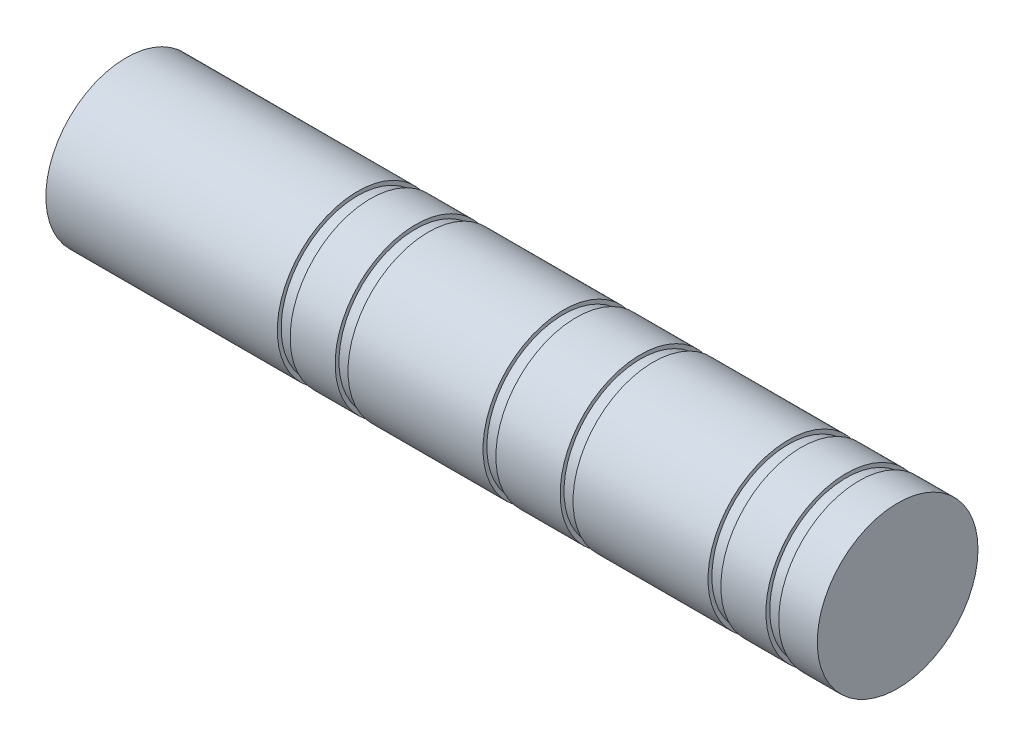
ISO-10303-21;
HEADER;
FILE_DESCRIPTION(('STEP AP214'),'2;1');
FILE_NAME('part.step','',(''),(''),'','','');
FILE_SCHEMA(('AUTOMOTIVE_DESIGN { 1 0 10303 214 1 1 1 1 }'));
ENDSEC;
DATA;
#1=APPLICATION_CONTEXT('core data for automotive mechanical design processes');
#2=APPLICATION_PROTOCOL_DEFINITION('international standard','automotive_design',2000,#1);
#3=PRODUCT_CONTEXT('',#1,'mechanical');
#4=PRODUCT('Part','Part','',(#3));
#5=PRODUCT_RELATED_PRODUCT_CATEGORY('part','',(#4));
#6=PRODUCT_DEFINITION_FORMATION('','',#4);
#7=PRODUCT_DEFINITION_CONTEXT('part definition',#1,'design');
#8=PRODUCT_DEFINITION('design','',#6,#7);
#9=PRODUCT_DEFINITION_SHAPE('','',#8);
#10=(LENGTH_UNIT() NAMED_UNIT(*) SI_UNIT(.MILLI.,.METRE.));
#11=(NAMED_UNIT(*) PLANE_ANGLE_UNIT() SI_UNIT($,.RADIAN.));
#12=(NAMED_UNIT(*) SI_UNIT($,.STERADIAN.) SOLID_ANGLE_UNIT());
#13=UNCERTAINTY_MEASURE_WITH_UNIT(LENGTH_MEASURE(1.E-05),#10,'distance_accuracy_value','');
#14=(GEOMETRIC_REPRESENTATION_CONTEXT(3) GLOBAL_UNCERTAINTY_ASSIGNED_CONTEXT((#13)) GLOBAL_UNIT_ASSIGNED_CONTEXT((#10,
#11,#12)) REPRESENTATION_CONTEXT('',''));
#15=CARTESIAN_POINT('',(0.,0.,0.));
#16=DIRECTION('',(0.,0.,1.));
#17=DIRECTION('',(1.,0.,0.));
#18=AXIS2_PLACEMENT_3D('',#15,#16,#17);
#19=CARTESIAN_POINT('',(12.,0.,0.));
#20=DIRECTION('',(-1.,0.,0.));
#21=DIRECTION('',(0.,0.,1.));
#22=AXIS2_PLACEMENT_3D('',#19,#20,#21);
#23=CYLINDRICAL_SURFACE('',#22,2.5);
#24=CARTESIAN_POINT('',(-4.8,0.,0.));
#25=DIRECTION('',(1.,0.,0.));
#26=DIRECTION('',(0.,0.,-1.));
#27=AXIS2_PLACEMENT_3D('',#24,#25,#26);
#28=CIRCLE('',#27,2.5);
#29=CARTESIAN_POINT('',(-4.8,0.,-2.5));
#30=VERTEX_POINT('',#29);
#31=EDGE_CURVE('E134',#30,#30,#28,.T.);
#32=ORIENTED_EDGE('',*,*,#31,.F.);
#33=EDGE_LOOP('',(#32));
#34=FACE_BOUND('',#33,.T.);
#35=CARTESIAN_POINT('',(-12.,0.,0.));
#36=DIRECTION('',(1.,0.,0.));
#37=DIRECTION('',(0.,0.,-1.));
#38=AXIS2_PLACEMENT_3D('',#35,#36,#37);
#39=CIRCLE('',#38,2.5);
#40=CARTESIAN_POINT('',(-12.,0.,-2.5));
#41=VERTEX_POINT('',#40);
#42=EDGE_CURVE('E48',#41,#41,#39,.T.);
#43=ORIENTED_EDGE('',*,*,#42,.T.);
#44=EDGE_LOOP('',(#43));
#45=FACE_BOUND('',#44,.T.);
#46=ADVANCED_FACE('F45',(#34,#45),#23,.T.);
#47=CARTESIAN_POINT('',(-12.,0.,0.));
#48=DIRECTION('',(1.,0.,0.));
#49=DIRECTION('',(0.,0.,-1.));
#50=AXIS2_PLACEMENT_3D('',#47,#48,#49);
#51=PLANE('',#50);
#52=CARTESIAN_POINT('',(-12.,0.,0.));
#53=DIRECTION('',(-1.,0.,0.));
#54=DIRECTION('',(0.,0.,1.));
#55=AXIS2_PLACEMENT_3D('',#52,#53,#54);
#56=CIRCLE('',#55,1.397);
#57=CARTESIAN_POINT('',(-12.,0.,1.397));
#58=VERTEX_POINT('',#57);
#59=EDGE_CURVE('E66',#58,#58,#56,.T.);
#60=ORIENTED_EDGE('',*,*,#59,.F.);
#61=EDGE_LOOP('',(#60));
#62=FACE_BOUND('',#61,.T.);
#63=ORIENTED_EDGE('',*,*,#42,.F.);
#64=EDGE_LOOP('',(#63));
#65=FACE_BOUND('',#64,.T.);
#66=ADVANCED_FACE('F59',(#62,#65),#51,.F.);
#67=CARTESIAN_POINT('',(-7.,0.,0.));
#68=DIRECTION('',(-1.,0.,0.));
#69=DIRECTION('',(0.,0.,1.));
#70=AXIS2_PLACEMENT_3D('',#67,#68,#69);
#71=CONICAL_SURFACE('',#70,1.397,1.02974425867665);
#72=CARTESIAN_POINT('',(-6.1605977152185,0.,0.));
#73=VERTEX_POINT('',#72);
#74=VERTEX_LOOP('',#73);
#75=FACE_BOUND('',#74,.T.);
#76=CARTESIAN_POINT('',(-7.,0.,0.));
#77=DIRECTION('',(-1.,0.,0.));
#78=DIRECTION('',(0.,0.,1.));
#79=AXIS2_PLACEMENT_3D('',#76,#77,#78);
#80=CIRCLE('',#79,1.397);
#81=CARTESIAN_POINT('',(-7.,0.,1.397));
#82=VERTEX_POINT('',#81);
#83=EDGE_CURVE('E63',#82,#82,#80,.T.);
#84=ORIENTED_EDGE('',*,*,#83,.T.);
#85=EDGE_LOOP('',(#84));
#86=FACE_BOUND('',#85,.T.);
#87=ADVANCED_FACE('F55',(#75,#86),#71,.F.);
#88=CARTESIAN_POINT('',(-12.,0.,0.));
#89=DIRECTION('',(-1.,0.,0.));
#90=DIRECTION('',(0.,0.,1.));
#91=AXIS2_PLACEMENT_3D('',#88,#89,#90);
#92=CYLINDRICAL_SURFACE('',#91,1.397);
#93=ORIENTED_EDGE('',*,*,#83,.F.);
#94=EDGE_LOOP('',(#93));
#95=FACE_BOUND('',#94,.T.);
#96=ORIENTED_EDGE('',*,*,#59,.T.);
#97=EDGE_LOOP('',(#96));
#98=FACE_BOUND('',#97,.T.);
#99=ADVANCED_FACE('F58',(#95,#98),#92,.F.);
#100=CARTESIAN_POINT('',(-4.4,0.,-2.5));
#101=DIRECTION('',(1.,0.,0.));
#102=DIRECTION('',(0.,0.,-1.));
#103=AXIS2_PLACEMENT_3D('',#100,#101,#102);
#104=PLANE('',#103);
#105=CARTESIAN_POINT('',(-4.4,0.,0.));
#106=DIRECTION('',(1.,0.,0.));
#107=DIRECTION('',(0.,0.,-1.));
#108=AXIS2_PLACEMENT_3D('',#105,#106,#107);
#109=CIRCLE('',#108,2.5);
#110=CARTESIAN_POINT('',(-4.4,0.,-2.5));
#111=VERTEX_POINT('',#110);
#112=EDGE_CURVE('E113',#111,#111,#109,.T.);
#113=ORIENTED_EDGE('',*,*,#112,.F.);
#114=EDGE_LOOP('',(#113));
#115=FACE_BOUND('',#114,.T.);
#116=CARTESIAN_POINT('',(-4.4,0.,0.));
#117=DIRECTION('',(1.,0.,0.));
#118=DIRECTION('',(0.,0.,-1.));
#119=AXIS2_PLACEMENT_3D('',#116,#117,#118);
#120=CIRCLE('',#119,2.38);
#121=CARTESIAN_POINT('',(-4.4,0.,-2.38));
#122=VERTEX_POINT('',#121);
#123=EDGE_CURVE('E92',#122,#122,#120,.T.);
#124=ORIENTED_EDGE('',*,*,#123,.T.);
#125=EDGE_LOOP('',(#124));
#126=FACE_BOUND('',#125,.T.);
#127=ADVANCED_FACE('F297',(#115,#126),#104,.F.);
#128=CARTESIAN_POINT('',(13.2,0.,0.));
#129=DIRECTION('',(1.,0.,0.));
#130=DIRECTION('',(0.,0.,-1.));
#131=AXIS2_PLACEMENT_3D('',#128,#129,#130);
#132=CYLINDRICAL_SURFACE('',#131,2.38);
#133=ORIENTED_EDGE('',*,*,#123,.F.);
#134=EDGE_LOOP('',(#133));
#135=FACE_BOUND('',#134,.T.);
#136=CARTESIAN_POINT('',(-4.8,0.,0.));
#137=DIRECTION('',(1.,0.,0.));
#138=DIRECTION('',(0.,0.,-1.));
#139=AXIS2_PLACEMENT_3D('',#136,#137,#138);
#140=CIRCLE('',#139,2.38);
#141=CARTESIAN_POINT('',(-4.8,0.,-2.38));
#142=VERTEX_POINT('',#141);
#143=EDGE_CURVE('E130',#142,#142,#140,.T.);
#144=ORIENTED_EDGE('',*,*,#143,.T.);
#145=EDGE_LOOP('',(#144));
#146=FACE_BOUND('',#145,.T.);
#147=ADVANCED_FACE('F264',(#135,#146),#132,.T.);
#148=CARTESIAN_POINT('',(-4.8,0.,-2.5));
#149=DIRECTION('',(-1.,0.,0.));
#150=DIRECTION('',(0.,0.,1.));
#151=AXIS2_PLACEMENT_3D('',#148,#149,#150);
#152=PLANE('',#151);
#153=ORIENTED_EDGE('',*,*,#143,.F.);
#154=EDGE_LOOP('',(#153));
#155=FACE_BOUND('',#154,.T.);
#156=ORIENTED_EDGE('',*,*,#31,.T.);
#157=EDGE_LOOP('',(#156));
#158=FACE_BOUND('',#157,.T.);
#159=ADVANCED_FACE('F255',(#155,#158),#152,.F.);
#160=CARTESIAN_POINT('',(-3.,0.,0.));
#161=DIRECTION('',(1.,0.,0.));
#162=DIRECTION('',(0.,0.,-1.));
#163=AXIS2_PLACEMENT_3D('',#160,#161,#162);
#164=CIRCLE('',#163,2.5);
#165=CARTESIAN_POINT('',(-3.,0.,-2.5));
#166=VERTEX_POINT('',#165);
#167=EDGE_CURVE('E84',#166,#166,#164,.T.);
#168=ORIENTED_EDGE('',*,*,#167,.F.);
#169=EDGE_LOOP('',(#168));
#170=FACE_BOUND('',#169,.T.);
#171=ORIENTED_EDGE('',*,*,#112,.T.);
#172=EDGE_LOOP('',(#171));
#173=FACE_BOUND('',#172,.T.);
#174=ADVANCED_FACE('F241',(#170,#173),#23,.T.);
#175=CARTESIAN_POINT('',(-2.6,0.,-2.5));
#176=DIRECTION('',(1.,0.,0.));
#177=DIRECTION('',(0.,0.,-1.));
#178=AXIS2_PLACEMENT_3D('',#175,#176,#177);
#179=PLANE('',#178);
#180=CARTESIAN_POINT('',(-2.6,0.,0.));
#181=DIRECTION('',(1.,0.,0.));
#182=DIRECTION('',(0.,0.,-1.));
#183=AXIS2_PLACEMENT_3D('',#180,#181,#182);
#184=CIRCLE('',#183,2.5);
#185=CARTESIAN_POINT('',(-2.6,0.,-2.5));
#186=VERTEX_POINT('',#185);
#187=EDGE_CURVE('E88',#186,#186,#184,.T.);
#188=ORIENTED_EDGE('',*,*,#187,.F.);
#189=EDGE_LOOP('',(#188));
#190=FACE_BOUND('',#189,.T.);
#191=CARTESIAN_POINT('',(-2.6,0.,0.));
#192=DIRECTION('',(1.,0.,0.));
#193=DIRECTION('',(0.,0.,-1.));
#194=AXIS2_PLACEMENT_3D('',#191,#192,#193);
#195=CIRCLE('',#194,2.38);
#196=CARTESIAN_POINT('',(-2.6,0.,-2.38));
#197=VERTEX_POINT('',#196);
#198=EDGE_CURVE('E75',#197,#197,#195,.T.);
#199=ORIENTED_EDGE('',*,*,#198,.T.);
#200=EDGE_LOOP('',(#199));
#201=FACE_BOUND('',#200,.T.);
#202=ADVANCED_FACE('F254',(#190,#201),#179,.F.);
#203=CARTESIAN_POINT('',(13.2,0.,0.));
#204=DIRECTION('',(1.,0.,0.));
#205=DIRECTION('',(0.,0.,-1.));
#206=AXIS2_PLACEMENT_3D('',#203,#204,#205);
#207=CYLINDRICAL_SURFACE('',#206,2.38);
#208=ORIENTED_EDGE('',*,*,#198,.F.);
#209=EDGE_LOOP('',(#208));
#210=FACE_BOUND('',#209,.T.);
#211=CARTESIAN_POINT('',(-3.,0.,0.));
#212=DIRECTION('',(1.,0.,0.));
#213=DIRECTION('',(0.,0.,-1.));
#214=AXIS2_PLACEMENT_3D('',#211,#212,#213);
#215=CIRCLE('',#214,2.38);
#216=CARTESIAN_POINT('',(-3.,0.,-2.38));
#217=VERTEX_POINT('',#216);
#218=EDGE_CURVE('E80',#217,#217,#215,.T.);
#219=ORIENTED_EDGE('',*,*,#218,.T.);
#220=EDGE_LOOP('',(#219));
#221=FACE_BOUND('',#220,.T.);
#222=ADVANCED_FACE('F261',(#210,#221),#207,.T.);
#223=CARTESIAN_POINT('',(-3.,0.,-2.5));
#224=DIRECTION('',(-1.,0.,0.));
#225=DIRECTION('',(0.,0.,1.));
#226=AXIS2_PLACEMENT_3D('',#223,#224,#225);
#227=PLANE('',#226);
#228=ORIENTED_EDGE('',*,*,#218,.F.);
#229=EDGE_LOOP('',(#228));
#230=FACE_BOUND('',#229,.T.);
#231=ORIENTED_EDGE('',*,*,#167,.T.);
#232=EDGE_LOOP('',(#231));
#233=FACE_BOUND('',#232,.T.);
#234=ADVANCED_FACE('F271',(#230,#233),#227,.F.);
#235=ORIENTED_EDGE('',*,*,#187,.T.);
#236=EDGE_LOOP('',(#235));
#237=FACE_BOUND('',#236,.T.);
#238=CARTESIAN_POINT('',(1.6,0.,0.));
#239=DIRECTION('',(1.,0.,0.));
#240=DIRECTION('',(0.,0.,-1.));
#241=AXIS2_PLACEMENT_3D('',#238,#239,#240);
#242=CIRCLE('',#241,2.5);
#243=CARTESIAN_POINT('',(1.6,0.,-2.5));
#244=VERTEX_POINT('',#243);
#245=EDGE_CURVE('E118',#244,#244,#242,.T.);
#246=ORIENTED_EDGE('',*,*,#245,.F.);
#247=EDGE_LOOP('',(#246));
#248=FACE_BOUND('',#247,.T.);
#249=ADVANCED_FACE('F197',(#237,#248),#23,.T.);
#250=CARTESIAN_POINT('',(2.,0.,-2.5));
#251=DIRECTION('',(1.,0.,0.));
#252=DIRECTION('',(0.,0.,-1.));
#253=AXIS2_PLACEMENT_3D('',#250,#251,#252);
#254=PLANE('',#253);
#255=CARTESIAN_POINT('',(2.,0.,0.));
#256=DIRECTION('',(1.,0.,0.));
#257=DIRECTION('',(0.,0.,-1.));
#258=AXIS2_PLACEMENT_3D('',#255,#256,#257);
#259=CIRCLE('',#258,2.5);
#260=CARTESIAN_POINT('',(2.,0.,-2.5));
#261=VERTEX_POINT('',#260);
#262=EDGE_CURVE('E122',#261,#261,#259,.T.);
#263=ORIENTED_EDGE('',*,*,#262,.F.);
#264=EDGE_LOOP('',(#263));
#265=FACE_BOUND('',#264,.T.);
#266=CARTESIAN_POINT('',(2.,0.,0.));
#267=DIRECTION('',(1.,0.,0.));
#268=DIRECTION('',(0.,0.,-1.));
#269=AXIS2_PLACEMENT_3D('',#266,#267,#268);
#270=CIRCLE('',#269,2.38);
#271=CARTESIAN_POINT('',(2.,0.,-2.38));
#272=VERTEX_POINT('',#271);
#273=EDGE_CURVE('E109',#272,#272,#270,.T.);
#274=ORIENTED_EDGE('',*,*,#273,.T.);
#275=EDGE_LOOP('',(#274));
#276=FACE_BOUND('',#275,.T.);
#277=ADVANCED_FACE('F270',(#265,#276),#254,.F.);
#278=CARTESIAN_POINT('',(13.2,0.,0.));
#279=DIRECTION('',(1.,0.,0.));
#280=DIRECTION('',(0.,0.,-1.));
#281=AXIS2_PLACEMENT_3D('',#278,#279,#280);
#282=CYLINDRICAL_SURFACE('',#281,2.38);
#283=ORIENTED_EDGE('',*,*,#273,.F.);
#284=EDGE_LOOP('',(#283));
#285=FACE_BOUND('',#284,.T.);
#286=CARTESIAN_POINT('',(1.6,0.,0.));
#287=DIRECTION('',(1.,0.,0.));
#288=DIRECTION('',(0.,0.,-1.));
#289=AXIS2_PLACEMENT_3D('',#286,#287,#288);
#290=CIRCLE('',#289,2.38);
#291=CARTESIAN_POINT('',(1.6,0.,-2.38));
#292=VERTEX_POINT('',#291);
#293=EDGE_CURVE('E114',#292,#292,#290,.T.);
#294=ORIENTED_EDGE('',*,*,#293,.T.);
#295=EDGE_LOOP('',(#294));
#296=FACE_BOUND('',#295,.T.);
#297=ADVANCED_FACE('F248',(#285,#296),#282,.T.);
#298=CARTESIAN_POINT('',(1.6,0.,-2.5));
#299=DIRECTION('',(-1.,0.,0.));
#300=DIRECTION('',(0.,0.,1.));
#301=AXIS2_PLACEMENT_3D('',#298,#299,#300);
#302=PLANE('',#301);
#303=ORIENTED_EDGE('',*,*,#293,.F.);
#304=EDGE_LOOP('',(#303));
#305=FACE_BOUND('',#304,.T.);
#306=ORIENTED_EDGE('',*,*,#245,.T.);
#307=EDGE_LOOP('',(#306));
#308=FACE_BOUND('',#307,.T.);
#309=ADVANCED_FACE('F239',(#305,#308),#302,.F.);
#310=CARTESIAN_POINT('',(4.,0.,0.));
#311=DIRECTION('',(1.,0.,0.));
#312=DIRECTION('',(0.,0.,-1.));
#313=AXIS2_PLACEMENT_3D('',#310,#311,#312);
#314=CIRCLE('',#313,2.5);
#315=CARTESIAN_POINT('',(4.,0.,-2.5));
#316=VERTEX_POINT('',#315);
#317=EDGE_CURVE('E148',#316,#316,#314,.T.);
#318=ORIENTED_EDGE('',*,*,#317,.F.);
#319=EDGE_LOOP('',(#318));
#320=FACE_BOUND('',#319,.T.);
#321=ORIENTED_EDGE('',*,*,#262,.T.);
#322=EDGE_LOOP('',(#321));
#323=FACE_BOUND('',#322,.T.);
#324=ADVANCED_FACE('F230',(#320,#323),#23,.T.);
#325=CARTESIAN_POINT('',(4.4,0.,-2.5));
#326=DIRECTION('',(1.,0.,0.));
#327=DIRECTION('',(0.,0.,-1.));
#328=AXIS2_PLACEMENT_3D('',#325,#326,#327);
#329=PLANE('',#328);
#330=CARTESIAN_POINT('',(4.4,0.,0.));
#331=DIRECTION('',(1.,0.,0.));
#332=DIRECTION('',(0.,0.,-1.));
#333=AXIS2_PLACEMENT_3D('',#330,#331,#332);
#334=CIRCLE('',#333,2.5);
#335=CARTESIAN_POINT('',(4.4,0.,-2.5));
#336=VERTEX_POINT('',#335);
#337=EDGE_CURVE('E152',#336,#336,#334,.T.);
#338=ORIENTED_EDGE('',*,*,#337,.F.);
#339=EDGE_LOOP('',(#338));
#340=FACE_BOUND('',#339,.T.);
#341=CARTESIAN_POINT('',(4.4,0.,0.));
#342=DIRECTION('',(1.,0.,0.));
#343=DIRECTION('',(0.,0.,-1.));
#344=AXIS2_PLACEMENT_3D('',#341,#342,#343);
#345=CIRCLE('',#344,2.38);
#346=CARTESIAN_POINT('',(4.4,0.,-2.38));
#347=VERTEX_POINT('',#346);
#348=EDGE_CURVE('E126',#347,#347,#345,.T.);
#349=ORIENTED_EDGE('',*,*,#348,.T.);
#350=EDGE_LOOP('',(#349));
#351=FACE_BOUND('',#350,.T.);
#352=ADVANCED_FACE('F238',(#340,#351),#329,.F.);
#353=CARTESIAN_POINT('',(13.2,0.,0.));
#354=DIRECTION('',(1.,0.,0.));
#355=DIRECTION('',(0.,0.,-1.));
#356=AXIS2_PLACEMENT_3D('',#353,#354,#355);
#357=CYLINDRICAL_SURFACE('',#356,2.38);
#358=ORIENTED_EDGE('',*,*,#348,.F.);
#359=EDGE_LOOP('',(#358));
#360=FACE_BOUND('',#359,.T.);
#361=CARTESIAN_POINT('',(4.,0.,0.));
#362=DIRECTION('',(1.,0.,0.));
#363=DIRECTION('',(0.,0.,-1.));
#364=AXIS2_PLACEMENT_3D('',#361,#362,#363);
#365=CIRCLE('',#364,2.38);
#366=CARTESIAN_POINT('',(4.,0.,-2.38));
#367=VERTEX_POINT('',#366);
#368=EDGE_CURVE('E144',#367,#367,#365,.T.);
#369=ORIENTED_EDGE('',*,*,#368,.T.);
#370=EDGE_LOOP('',(#369));
#371=FACE_BOUND('',#370,.T.);
#372=ADVANCED_FACE('F224',(#360,#371),#357,.T.);
#373=CARTESIAN_POINT('',(4.,0.,-2.5));
#374=DIRECTION('',(-1.,0.,0.));
#375=DIRECTION('',(0.,0.,1.));
#376=AXIS2_PLACEMENT_3D('',#373,#374,#375);
#377=PLANE('',#376);
#378=ORIENTED_EDGE('',*,*,#368,.F.);
#379=EDGE_LOOP('',(#378));
#380=FACE_BOUND('',#379,.T.);
#381=ORIENTED_EDGE('',*,*,#317,.T.);
#382=EDGE_LOOP('',(#381));
#383=FACE_BOUND('',#382,.T.);
#384=ADVANCED_FACE('F219',(#380,#383),#377,.F.);
#385=ORIENTED_EDGE('',*,*,#337,.T.);
#386=EDGE_LOOP('',(#385));
#387=FACE_BOUND('',#386,.T.);
#388=CARTESIAN_POINT('',(8.6,0.,0.));
#389=DIRECTION('',(1.,0.,0.));
#390=DIRECTION('',(0.,0.,-1.));
#391=AXIS2_PLACEMENT_3D('',#388,#389,#390);
#392=CIRCLE('',#391,2.5);
#393=CARTESIAN_POINT('',(8.6,0.,-2.5));
#394=VERTEX_POINT('',#393);
#395=EDGE_CURVE('E102',#394,#394,#392,.T.);
#396=ORIENTED_EDGE('',*,*,#395,.F.);
#397=EDGE_LOOP('',(#396));
#398=FACE_BOUND('',#397,.T.);
#399=ADVANCED_FACE('F198',(#387,#398),#23,.T.);
#400=CARTESIAN_POINT('',(9.,0.,-2.5));
#401=DIRECTION('',(1.,0.,0.));
#402=DIRECTION('',(0.,0.,-1.));
#403=AXIS2_PLACEMENT_3D('',#400,#401,#402);
#404=PLANE('',#403);
#405=CARTESIAN_POINT('',(9.,0.,0.));
#406=DIRECTION('',(1.,0.,0.));
#407=DIRECTION('',(0.,0.,-1.));
#408=AXIS2_PLACEMENT_3D('',#405,#406,#407);
#409=CIRCLE('',#408,2.5);
#410=CARTESIAN_POINT('',(9.,0.,-2.5));
#411=VERTEX_POINT('',#410);
#412=EDGE_CURVE('E79',#411,#411,#409,.T.);
#413=ORIENTED_EDGE('',*,*,#412,.F.);
#414=EDGE_LOOP('',(#413));
#415=FACE_BOUND('',#414,.T.);
#416=CARTESIAN_POINT('',(9.,0.,0.));
#417=DIRECTION('',(1.,0.,0.));
#418=DIRECTION('',(0.,0.,-1.));
#419=AXIS2_PLACEMENT_3D('',#416,#417,#418);
#420=CIRCLE('',#419,2.38);
#421=CARTESIAN_POINT('',(9.,0.,-2.38));
#422=VERTEX_POINT('',#421);
#423=EDGE_CURVE('E93',#422,#422,#420,.T.);
#424=ORIENTED_EDGE('',*,*,#423,.T.);
#425=EDGE_LOOP('',(#424));
#426=FACE_BOUND('',#425,.T.);
#427=ADVANCED_FACE('F201',(#415,#426),#404,.F.);
#428=CARTESIAN_POINT('',(13.2,0.,0.));
#429=DIRECTION('',(1.,0.,0.));
#430=DIRECTION('',(0.,0.,-1.));
#431=AXIS2_PLACEMENT_3D('',#428,#429,#430);
#432=CYLINDRICAL_SURFACE('',#431,2.38);
#433=ORIENTED_EDGE('',*,*,#423,.F.);
#434=EDGE_LOOP('',(#433));
#435=FACE_BOUND('',#434,.T.);
#436=CARTESIAN_POINT('',(8.6,0.,0.));
#437=DIRECTION('',(1.,0.,0.));
#438=DIRECTION('',(0.,0.,-1.));
#439=AXIS2_PLACEMENT_3D('',#436,#437,#438);
#440=CIRCLE('',#439,2.38);
#441=CARTESIAN_POINT('',(8.6,0.,-2.38));
#442=VERTEX_POINT('',#441);
#443=EDGE_CURVE('E98',#442,#442,#440,.T.);
#444=ORIENTED_EDGE('',*,*,#443,.T.);
#445=EDGE_LOOP('',(#444));
#446=FACE_BOUND('',#445,.T.);
#447=ADVANCED_FACE('F204',(#435,#446),#432,.T.);
#448=CARTESIAN_POINT('',(8.6,0.,-2.5));
#449=DIRECTION('',(-1.,0.,0.));
#450=DIRECTION('',(0.,0.,1.));
#451=AXIS2_PLACEMENT_3D('',#448,#449,#450);
#452=PLANE('',#451);
#453=ORIENTED_EDGE('',*,*,#443,.F.);
#454=EDGE_LOOP('',(#453));
#455=FACE_BOUND('',#454,.T.);
#456=ORIENTED_EDGE('',*,*,#395,.T.);
#457=EDGE_LOOP('',(#456));
#458=FACE_BOUND('',#457,.T.);
#459=ADVANCED_FACE('F196',(#455,#458),#452,.F.);
#460=CARTESIAN_POINT('',(10.4,0.,0.));
#461=DIRECTION('',(1.,0.,0.));
#462=DIRECTION('',(0.,0.,-1.));
#463=AXIS2_PLACEMENT_3D('',#460,#461,#462);
#464=CIRCLE('',#463,2.5);
#465=CARTESIAN_POINT('',(10.4,0.,-2.5));
#466=VERTEX_POINT('',#465);
#467=EDGE_CURVE('E163',#466,#466,#464,.T.);
#468=ORIENTED_EDGE('',*,*,#467,.F.);
#469=EDGE_LOOP('',(#468));
#470=FACE_BOUND('',#469,.T.);
#471=ORIENTED_EDGE('',*,*,#412,.T.);
#472=EDGE_LOOP('',(#471));
#473=FACE_BOUND('',#472,.T.);
#474=ADVANCED_FACE('F178',(#470,#473),#23,.T.);
#475=CARTESIAN_POINT('',(10.8,0.,-2.5));
#476=DIRECTION('',(1.,0.,0.));
#477=DIRECTION('',(0.,0.,-1.));
#478=AXIS2_PLACEMENT_3D('',#475,#476,#477);
#479=PLANE('',#478);
#480=CARTESIAN_POINT('',(10.8,0.,0.));
#481=DIRECTION('',(1.,0.,0.));
#482=DIRECTION('',(0.,0.,-1.));
#483=AXIS2_PLACEMENT_3D('',#480,#481,#482);
#484=CIRCLE('',#483,2.5);
#485=CARTESIAN_POINT('',(10.8,0.,-2.5));
#486=VERTEX_POINT('',#485);
#487=EDGE_CURVE('E97',#486,#486,#484,.T.);
#488=ORIENTED_EDGE('',*,*,#487,.F.);
#489=EDGE_LOOP('',(#488));
#490=FACE_BOUND('',#489,.T.);
#491=CARTESIAN_POINT('',(10.8,0.,0.));
#492=DIRECTION('',(1.,0.,0.));
#493=DIRECTION('',(0.,0.,-1.));
#494=AXIS2_PLACEMENT_3D('',#491,#492,#493);
#495=CIRCLE('',#494,2.38);
#496=CARTESIAN_POINT('',(10.8,0.,-2.38));
#497=VERTEX_POINT('',#496);
#498=EDGE_CURVE('E72',#497,#497,#495,.T.);
#499=ORIENTED_EDGE('',*,*,#498,.T.);
#500=EDGE_LOOP('',(#499));
#501=FACE_BOUND('',#500,.T.);
#502=ADVANCED_FACE('F174',(#490,#501),#479,.F.);
#503=CARTESIAN_POINT('',(13.2,0.,0.));
#504=DIRECTION('',(1.,0.,0.));
#505=DIRECTION('',(0.,0.,-1.));
#506=AXIS2_PLACEMENT_3D('',#503,#504,#505);
#507=CYLINDRICAL_SURFACE('',#506,2.38);
#508=ORIENTED_EDGE('',*,*,#498,.F.);
#509=EDGE_LOOP('',(#508));
#510=FACE_BOUND('',#509,.T.);
#511=CARTESIAN_POINT('',(10.4,0.,0.));
#512=DIRECTION('',(1.,0.,0.));
#513=DIRECTION('',(0.,0.,-1.));
#514=AXIS2_PLACEMENT_3D('',#511,#512,#513);
#515=CIRCLE('',#514,2.38);
#516=CARTESIAN_POINT('',(10.4,0.,-2.38));
#517=VERTEX_POINT('',#516);
#518=EDGE_CURVE('E159',#517,#517,#515,.T.);
#519=ORIENTED_EDGE('',*,*,#518,.T.);
#520=EDGE_LOOP('',(#519));
#521=FACE_BOUND('',#520,.T.);
#522=ADVANCED_FACE('F177',(#510,#521),#507,.T.);
#523=CARTESIAN_POINT('',(10.4,0.,-2.5));
#524=DIRECTION('',(-1.,0.,0.));
#525=DIRECTION('',(0.,0.,1.));
#526=AXIS2_PLACEMENT_3D('',#523,#524,#525);
#527=PLANE('',#526);
#528=ORIENTED_EDGE('',*,*,#518,.F.);
#529=EDGE_LOOP('',(#528));
#530=FACE_BOUND('',#529,.T.);
#531=ORIENTED_EDGE('',*,*,#467,.T.);
#532=EDGE_LOOP('',(#531));
#533=FACE_BOUND('',#532,.T.);
#534=ADVANCED_FACE('F184',(#530,#533),#527,.F.);
#535=CARTESIAN_POINT('',(12.,0.,0.));
#536=DIRECTION('',(1.,0.,0.));
#537=DIRECTION('',(0.,0.,-1.));
#538=AXIS2_PLACEMENT_3D('',#535,#536,#537);
#539=PLANE('',#538);
#540=CARTESIAN_POINT('',(12.,0.,0.));
#541=DIRECTION('',(1.,0.,0.));
#542=DIRECTION('',(0.,0.,-1.));
#543=AXIS2_PLACEMENT_3D('',#540,#541,#542);
#544=CIRCLE('',#543,2.5);
#545=CARTESIAN_POINT('',(12.,0.,-2.5));
#546=VERTEX_POINT('',#545);
#547=EDGE_CURVE('E11',#546,#546,#544,.T.);
#548=ORIENTED_EDGE('',*,*,#547,.T.);
#549=EDGE_LOOP('',(#548));
#550=FACE_BOUND('',#549,.T.);
#551=ADVANCED_FACE('F190',(#550),#539,.T.);
#552=ORIENTED_EDGE('',*,*,#487,.T.);
#553=EDGE_LOOP('',(#552));
#554=FACE_BOUND('',#553,.T.);
#555=ORIENTED_EDGE('',*,*,#547,.F.);
#556=EDGE_LOOP('',(#555));
#557=FACE_BOUND('',#556,.T.);
#558=ADVANCED_FACE('F171',(#554,#557),#23,.T.);
#559=CLOSED_SHELL('',(#46,#66,#87,#99,#127,#147,#159,#174,#202,#222,#234,#249,#277,#297,#309,
#324,#352,#372,#384,#399,#427,#447,#459,#474,#502,#522,#534,#551,#558));
#560=MANIFOLD_SOLID_BREP('B2',#559);
#561=ADVANCED_BREP_SHAPE_REPRESENTATION('',(#18,#560),#14);
#562=SHAPE_DEFINITION_REPRESENTATION(#9,#561);
ENDSEC;
END-ISO-10303-21;
